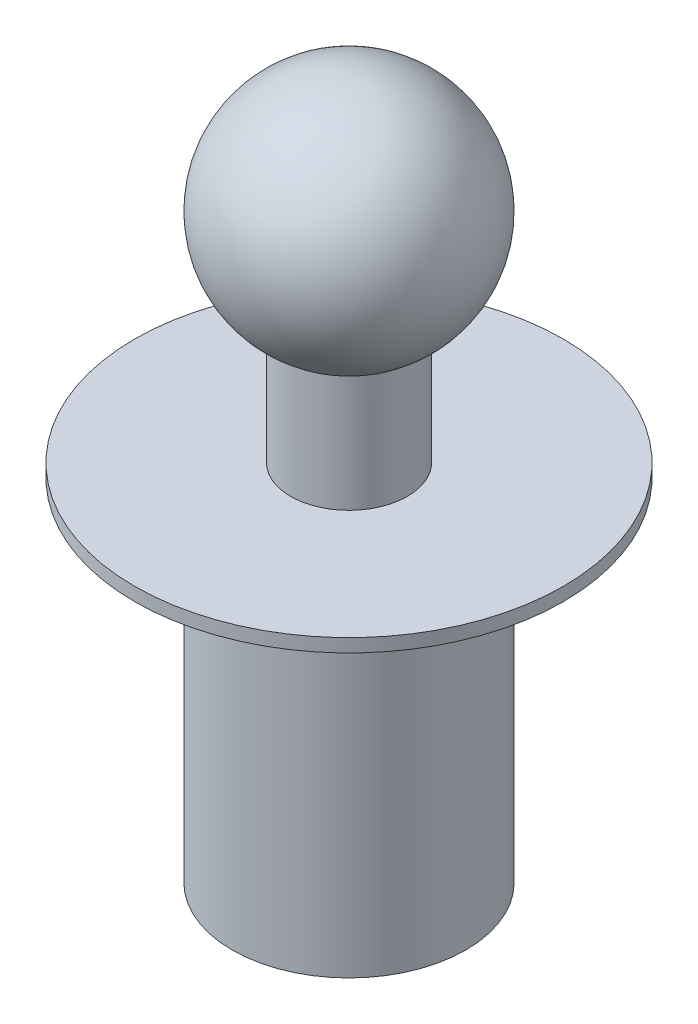
ISO-10303-21;
HEADER;
FILE_DESCRIPTION(('STEP AP214'),'2;1');
FILE_NAME('part.step','',(''),(''),'','','');
FILE_SCHEMA(('AUTOMOTIVE_DESIGN { 1 0 10303 214 1 1 1 1 }'));
ENDSEC;
DATA;
#1=APPLICATION_CONTEXT('core data for automotive mechanical design processes');
#2=APPLICATION_PROTOCOL_DEFINITION('international standard','automotive_design',2000,#1);
#3=PRODUCT_CONTEXT('',#1,'mechanical');
#4=PRODUCT('Part','Part','',(#3));
#5=PRODUCT_RELATED_PRODUCT_CATEGORY('part','',(#4));
#6=PRODUCT_DEFINITION_FORMATION('','',#4);
#7=PRODUCT_DEFINITION_CONTEXT('part definition',#1,'design');
#8=PRODUCT_DEFINITION('design','',#6,#7);
#9=PRODUCT_DEFINITION_SHAPE('','',#8);
#10=(LENGTH_UNIT() NAMED_UNIT(*) SI_UNIT(.MILLI.,.METRE.));
#11=(NAMED_UNIT(*) PLANE_ANGLE_UNIT() SI_UNIT($,.RADIAN.));
#12=(NAMED_UNIT(*) SI_UNIT($,.STERADIAN.) SOLID_ANGLE_UNIT());
#13=UNCERTAINTY_MEASURE_WITH_UNIT(LENGTH_MEASURE(1.E-05),#10,'distance_accuracy_value','');
#14=(GEOMETRIC_REPRESENTATION_CONTEXT(3) GLOBAL_UNCERTAINTY_ASSIGNED_CONTEXT((#13)) GLOBAL_UNIT_ASSIGNED_CONTEXT((#10,
#11,#12)) REPRESENTATION_CONTEXT('',''));
#15=CARTESIAN_POINT('',(0.,0.,0.));
#16=DIRECTION('',(0.,0.,1.));
#17=DIRECTION('',(1.,0.,0.));
#18=AXIS2_PLACEMENT_3D('',#15,#16,#17);
#19=CARTESIAN_POINT('',(0.,-3.,0.));
#20=DIRECTION('',(0.,-1.,0.));
#21=DIRECTION('',(0.,0.,-1.));
#22=AXIS2_PLACEMENT_3D('',#19,#20,#21);
#23=PLANE('',#22);
#24=CARTESIAN_POINT('',(0.,-3.,0.));
#25=DIRECTION('',(0.,-1.,0.));
#26=DIRECTION('',(0.,0.,-1.));
#27=AXIS2_PLACEMENT_3D('',#24,#25,#26);
#28=CIRCLE('',#27,1.);
#29=CARTESIAN_POINT('',(0.,-3.,-1.));
#30=VERTEX_POINT('',#29);
#31=EDGE_CURVE('E10',#30,#30,#28,.T.);
#32=ORIENTED_EDGE('',*,*,#31,.T.);
#33=EDGE_LOOP('',(#32));
#34=FACE_BOUND('',#33,.T.);
#35=ADVANCED_FACE('F31',(#34),#23,.T.);
#36=CARTESIAN_POINT('',(0.,-3.,0.));
#37=DIRECTION('',(0.,-1.,0.));
#38=DIRECTION('',(0.,0.,-1.));
#39=AXIS2_PLACEMENT_3D('',#36,#37,#38);
#40=CYLINDRICAL_SURFACE('',#39,1.);
#41=CARTESIAN_POINT('',(0.,0.,0.));
#42=DIRECTION('',(0.,-1.,0.));
#43=DIRECTION('',(0.,0.,-1.));
#44=AXIS2_PLACEMENT_3D('',#41,#42,#43);
#45=CIRCLE('',#44,0.999999999999999);
#46=CARTESIAN_POINT('',(0.,0.,-0.999999999999999));
#47=VERTEX_POINT('',#46);
#48=EDGE_CURVE('E37',#47,#47,#45,.T.);
#49=ORIENTED_EDGE('',*,*,#48,.T.);
#50=EDGE_LOOP('',(#49));
#51=FACE_BOUND('',#50,.T.);
#52=ORIENTED_EDGE('',*,*,#31,.F.);
#53=EDGE_LOOP('',(#52));
#54=FACE_BOUND('',#53,.T.);
#55=ADVANCED_FACE('F69',(#51,#54),#40,.T.);
#56=CARTESIAN_POINT('',(1.,0.,0.));
#57=DIRECTION('',(0.,-1.,0.));
#58=DIRECTION('',(0.,0.,-1.));
#59=AXIS2_PLACEMENT_3D('',#56,#57,#58);
#60=PLANE('',#59);
#61=CARTESIAN_POINT('',(0.,0.,0.));
#62=DIRECTION('',(0.,-1.,0.));
#63=DIRECTION('',(0.,0.,-1.));
#64=AXIS2_PLACEMENT_3D('',#61,#62,#63);
#65=CIRCLE('',#64,1.83457776137519);
#66=CARTESIAN_POINT('',(0.,0.,-1.83457776137519));
#67=VERTEX_POINT('',#66);
#68=EDGE_CURVE('E41',#67,#67,#65,.T.);
#69=ORIENTED_EDGE('',*,*,#68,.T.);
#70=EDGE_LOOP('',(#69));
#71=FACE_BOUND('',#70,.T.);
#72=ORIENTED_EDGE('',*,*,#48,.F.);
#73=EDGE_LOOP('',(#72));
#74=FACE_BOUND('',#73,.T.);
#75=ADVANCED_FACE('F73',(#71,#74),#60,.T.);
#76=CARTESIAN_POINT('',(0.,-3.,0.));
#77=DIRECTION('',(0.,-1.,0.));
#78=DIRECTION('',(0.,0.,-1.));
#79=AXIS2_PLACEMENT_3D('',#76,#77,#78);
#80=CYLINDRICAL_SURFACE('',#79,1.83457776137519);
#81=CARTESIAN_POINT('',(0.,0.113786683570538,0.));
#82=DIRECTION('',(0.,-1.,0.));
#83=DIRECTION('',(0.,0.,-1.));
#84=AXIS2_PLACEMENT_3D('',#81,#82,#83);
#85=CIRCLE('',#84,1.83457776137519);
#86=CARTESIAN_POINT('',(0.,0.113786683570538,-1.83457776137519));
#87=VERTEX_POINT('',#86);
#88=EDGE_CURVE('E45',#87,#87,#85,.T.);
#89=ORIENTED_EDGE('',*,*,#88,.T.);
#90=EDGE_LOOP('',(#89));
#91=FACE_BOUND('',#90,.T.);
#92=ORIENTED_EDGE('',*,*,#68,.F.);
#93=EDGE_LOOP('',(#92));
#94=FACE_BOUND('',#93,.T.);
#95=ADVANCED_FACE('F77',(#91,#94),#80,.T.);
#96=CARTESIAN_POINT('',(1.83457776137519,0.113786683570538,0.));
#97=DIRECTION('',(0.,1.,0.));
#98=DIRECTION('',(0.,0.,1.));
#99=AXIS2_PLACEMENT_3D('',#96,#97,#98);
#100=PLANE('',#99);
#101=CARTESIAN_POINT('',(0.,0.113786683570538,0.));
#102=DIRECTION('',(0.,-1.,0.));
#103=DIRECTION('',(0.,0.,-1.));
#104=AXIS2_PLACEMENT_3D('',#101,#102,#103);
#105=CIRCLE('',#104,0.499999999999999);
#106=CARTESIAN_POINT('',(0.,0.113786683570538,-0.499999999999999));
#107=VERTEX_POINT('',#106);
#108=EDGE_CURVE('E50',#107,#107,#105,.T.);
#109=ORIENTED_EDGE('',*,*,#108,.T.);
#110=EDGE_LOOP('',(#109));
#111=FACE_BOUND('',#110,.T.);
#112=ORIENTED_EDGE('',*,*,#88,.F.);
#113=EDGE_LOOP('',(#112));
#114=FACE_BOUND('',#113,.T.);
#115=ADVANCED_FACE('F66',(#111,#114),#100,.T.);
#116=CARTESIAN_POINT('',(0.,-3.,0.));
#117=DIRECTION('',(0.,-1.,0.));
#118=DIRECTION('',(0.,0.,-1.));
#119=AXIS2_PLACEMENT_3D('',#116,#117,#118);
#120=CYLINDRICAL_SURFACE('',#119,0.499999999999999);
#121=CARTESIAN_POINT('',(0.,1.11378668357054,0.));
#122=DIRECTION('',(0.,-1.,0.));
#123=DIRECTION('',(0.,0.,-1.));
#124=AXIS2_PLACEMENT_3D('',#121,#122,#123);
#125=CIRCLE('',#124,0.499999999999999);
#126=CARTESIAN_POINT('',(0.,1.11378668357054,-0.499999999999999));
#127=VERTEX_POINT('',#126);
#128=EDGE_CURVE('E53',#127,#127,#125,.T.);
#129=ORIENTED_EDGE('',*,*,#128,.T.);
#130=EDGE_LOOP('',(#129));
#131=FACE_BOUND('',#130,.T.);
#132=ORIENTED_EDGE('',*,*,#108,.F.);
#133=EDGE_LOOP('',(#132));
#134=FACE_BOUND('',#133,.T.);
#135=ADVANCED_FACE('F57',(#131,#134),#120,.T.);
#136=CARTESIAN_POINT('',(0.,1.97981208735498,0.));
#137=DIRECTION('',(0.,-1.,0.));
#138=DIRECTION('',(1.,0.,0.));
#139=AXIS2_PLACEMENT_3D('',#136,#137,#138);
#140=SPHERICAL_SURFACE('',#139,1.);
#141=ORIENTED_EDGE('',*,*,#128,.F.);
#142=EDGE_LOOP('',(#141));
#143=FACE_BOUND('',#142,.T.);
#144=ADVANCED_FACE('F60',(#143),#140,.T.);
#145=CLOSED_SHELL('',(#35,#55,#75,#95,#115,#135,#144));
#146=MANIFOLD_SOLID_BREP('B2',#145);
#147=ADVANCED_BREP_SHAPE_REPRESENTATION('',(#18,#146),#14);
#148=SHAPE_DEFINITION_REPRESENTATION(#9,#147);
ENDSEC;
END-ISO-10303-21;
